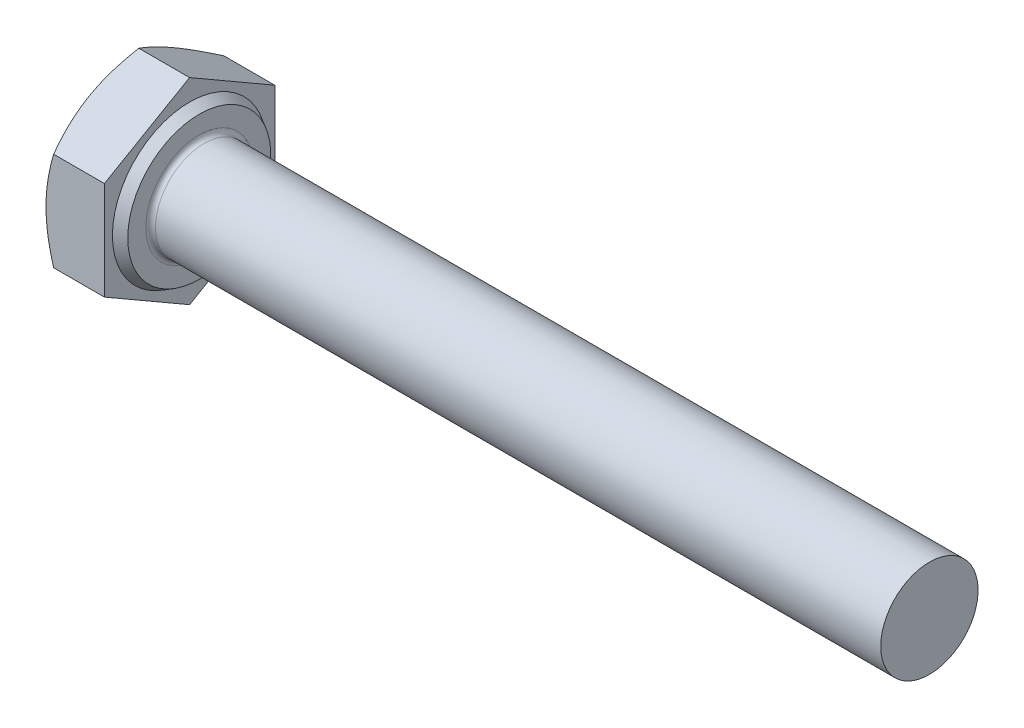
ISO-10303-21;
HEADER;
FILE_DESCRIPTION(('STEP AP214'),'2;1');
FILE_NAME('part.step','',(''),(''),'','','');
FILE_SCHEMA(('AUTOMOTIVE_DESIGN { 1 0 10303 214 1 1 1 1 }'));
ENDSEC;
DATA;
#1=APPLICATION_CONTEXT('core data for automotive mechanical design processes');
#2=APPLICATION_PROTOCOL_DEFINITION('international standard','automotive_design',2000,#1);
#3=PRODUCT_CONTEXT('',#1,'mechanical');
#4=PRODUCT('Part','Part','',(#3));
#5=PRODUCT_RELATED_PRODUCT_CATEGORY('part','',(#4));
#6=PRODUCT_DEFINITION_FORMATION('','',#4);
#7=PRODUCT_DEFINITION_CONTEXT('part definition',#1,'design');
#8=PRODUCT_DEFINITION('design','',#6,#7);
#9=PRODUCT_DEFINITION_SHAPE('','',#8);
#10=(LENGTH_UNIT() NAMED_UNIT(*) SI_UNIT(.MILLI.,.METRE.));
#11=(NAMED_UNIT(*) PLANE_ANGLE_UNIT() SI_UNIT($,.RADIAN.));
#12=(NAMED_UNIT(*) SI_UNIT($,.STERADIAN.) SOLID_ANGLE_UNIT());
#13=UNCERTAINTY_MEASURE_WITH_UNIT(LENGTH_MEASURE(1.E-05),#10,'distance_accuracy_value','');
#14=(GEOMETRIC_REPRESENTATION_CONTEXT(3) GLOBAL_UNCERTAINTY_ASSIGNED_CONTEXT((#13)) GLOBAL_UNIT_ASSIGNED_CONTEXT((#10,
#11,#12)) REPRESENTATION_CONTEXT('',''));
#15=CARTESIAN_POINT('',(0.,0.,0.));
#16=DIRECTION('',(0.,0.,1.));
#17=DIRECTION('',(1.,0.,0.));
#18=AXIS2_PLACEMENT_3D('',#15,#16,#17);
#19=CARTESIAN_POINT('',(2.8,2.02072594216369,-3.5));
#20=DIRECTION('',(0.,-0.866025403784438,0.500000000000001));
#21=DIRECTION('',(0.,-0.500000000000001,-0.866025403784438));
#22=AXIS2_PLACEMENT_3D('',#19,#20,#21);
#23=PLANE('',#22);
#24=DIRECTION('',(0.,0.500000000000001,0.866025403784438));
#25=VECTOR('',#24,1.);
#26=CARTESIAN_POINT('',(2.4,2.02072594216369,-3.5));
#27=LINE('',#26,#25);
#28=CARTESIAN_POINT('',(2.4,2.02072594216369,-3.5));
#29=VERTEX_POINT('',#28);
#30=CARTESIAN_POINT('',(2.4,4.04145188432738,0.));
#31=VERTEX_POINT('',#30);
#32=EDGE_CURVE('E115',#29,#31,#27,.T.);
#33=ORIENTED_EDGE('',*,*,#32,.F.);
#34=DIRECTION('',(-1.,0.,0.));
#35=VECTOR('',#34,1.);
#36=CARTESIAN_POINT('',(2.8,2.02072594216369,-3.5));
#37=LINE('',#36,#35);
#38=CARTESIAN_POINT('',(0.312607391169641,2.02072594216369,-3.5));
#39=VERTEX_POINT('',#38);
#40=EDGE_CURVE('E263',#29,#39,#37,.T.);
#41=ORIENTED_EDGE('',*,*,#40,.T.);
#42=CARTESIAN_POINT('',(0.312674060693371,4.04156735438122,0.0002));
#43=CARTESIAN_POINT('',(0.261385788989984,3.9527667384984,-0.153607178452449));
#44=CARTESIAN_POINT('',(0.214740953816197,3.86319960126198,-0.308742010834424));
#45=CARTESIAN_POINT('',(0.133321875533349,3.68251437287562,-0.621698006576781));
#46=CARTESIAN_POINT('',(0.0985764355845619,3.59139307116725,-0.779524730787495));
#47=CARTESIAN_POINT('',(0.0444900271828364,3.41027974688034,-1.09322221038013));
#48=CARTESIAN_POINT('',(0.0247890862603817,3.32031559103708,-1.24904469916069));
#49=CARTESIAN_POINT('',(0.00127013273725419,3.13996396008052,-1.56142288720537));
#50=CARTESIAN_POINT('',(-0.00256735545443515,3.04957714051106,-1.71797745103423));
#51=CARTESIAN_POINT('',(0.00541530187697707,2.88068384499777,-2.01050921992099));
#52=CARTESIAN_POINT('',(0.0152754340696065,2.80215208834114,-2.14653021245791));
#53=CARTESIAN_POINT('',(0.0465264668994026,2.64560020969753,-2.41768602028899));
#54=CARTESIAN_POINT('',(0.067928043285797,2.56758062920649,-2.55281989768468));
#55=CARTESIAN_POINT('',(0.121430407880576,2.41070596159678,-2.82453479240518));
#56=CARTESIAN_POINT('',(0.153757994445085,2.33187072981463,-2.96108141927834));
#57=CARTESIAN_POINT('',(0.227128933807992,2.17537608630782,-3.2321380929445));
#58=CARTESIAN_POINT('',(0.268155046569865,2.09771466960098,-3.36665161246854));
#59=CARTESIAN_POINT('',(0.312674060693369,2.02061047210985,-3.5002));
#60=B_SPLINE_CURVE_WITH_KNOTS('',3,(#42,#43,#44,#45,#46,#47,#48,#49,#50,#51,#52,#53,#54,#55,#56,
#57,#58,#59),.UNSPECIFIED.,.F.,.F.,(4,2,2,2,2,2,2,2,4),(0.,0.554793832886254,1.11092123814984,
1.65328467083219,2.19498204478403,2.6666513085086,3.13875761298267,3.6213361260051,
4.10296698719188),.UNSPECIFIED.);
#61=CARTESIAN_POINT('',(0.,3.03108891324553,-1.75));
#62=VERTEX_POINT('',#61);
#63=EDGE_CURVE('E171',#62,#39,#60,.T.);
#64=ORIENTED_EDGE('',*,*,#63,.F.);
#65=CARTESIAN_POINT('',(0.312607391169643,4.04145188432738,0.));
#66=VERTEX_POINT('',#65);
#67=EDGE_CURVE('E61',#66,#62,#60,.T.);
#68=ORIENTED_EDGE('',*,*,#67,.F.);
#69=DIRECTION('',(-1.,0.,0.));
#70=VECTOR('',#69,1.);
#71=CARTESIAN_POINT('',(2.8,4.04145188432738,0.));
#72=LINE('',#71,#70);
#73=EDGE_CURVE('E134',#31,#66,#72,.T.);
#74=ORIENTED_EDGE('',*,*,#73,.F.);
#75=EDGE_LOOP('',(#33,#41,#64,#68,#74));
#76=FACE_BOUND('',#75,.T.);
#77=ADVANCED_FACE('F38',(#76),#23,.F.);
#78=CARTESIAN_POINT('',(2.8,4.04145188432738,0.));
#79=DIRECTION('',(0.,-0.866025403784438,-0.500000000000001));
#80=DIRECTION('',(0.,0.500000000000001,-0.866025403784438));
#81=AXIS2_PLACEMENT_3D('',#78,#79,#80);
#82=PLANE('',#81);
#83=DIRECTION('',(0.,-0.500000000000001,0.866025403784438));
#84=VECTOR('',#83,1.);
#85=CARTESIAN_POINT('',(2.4,4.04145188432738,0.));
#86=LINE('',#85,#84);
#87=CARTESIAN_POINT('',(2.4,2.0207259421637,3.5));
#88=VERTEX_POINT('',#87);
#89=EDGE_CURVE('E109',#31,#88,#86,.T.);
#90=ORIENTED_EDGE('',*,*,#89,.F.);
#91=ORIENTED_EDGE('',*,*,#73,.T.);
#92=CARTESIAN_POINT('',(0.312674060693369,2.02061047210985,3.5002));
#93=CARTESIAN_POINT('',(0.261385788989982,2.10941108799267,3.34639282154755));
#94=CARTESIAN_POINT('',(0.214740953816196,2.19897822522909,3.19125798916558));
#95=CARTESIAN_POINT('',(0.133321875533348,2.37966345361545,2.87830199342322));
#96=CARTESIAN_POINT('',(0.0985764355845611,2.47078475532382,2.7204752692125));
#97=CARTESIAN_POINT('',(0.044490027182836,2.65189807961073,2.40677778961987));
#98=CARTESIAN_POINT('',(0.0247890862603815,2.74186223545399,2.25095530083931));
#99=CARTESIAN_POINT('',(0.00127013273725459,2.92221386641056,1.93857711279463));
#100=CARTESIAN_POINT('',(-0.00256735545443442,3.01260068598001,1.78202254896577));
#101=CARTESIAN_POINT('',(0.00541530187697819,3.1814939814933,1.48949078007901));
#102=CARTESIAN_POINT('',(0.0152754340696077,3.26002573814993,1.35346978754209));
#103=CARTESIAN_POINT('',(0.0465264668994042,3.41657761679354,1.08231397971101));
#104=CARTESIAN_POINT('',(0.0679280432857989,3.49459719728458,0.947180102315318));
#105=CARTESIAN_POINT('',(0.121430407880578,3.65147186489429,0.675465207594817));
#106=CARTESIAN_POINT('',(0.153757994445088,3.73030709667644,0.538918580721665));
#107=CARTESIAN_POINT('',(0.227128933807995,3.88680174018324,0.267861907055498));
#108=CARTESIAN_POINT('',(0.268155046569867,3.96446315689009,0.133348387531463));
#109=CARTESIAN_POINT('',(0.312674060693371,4.04156735438122,-0.000200000000000185));
#110=B_SPLINE_CURVE_WITH_KNOTS('',3,(#92,#93,#94,#95,#96,#97,#98,#99,#100,#101,#102,#103,#104,
#105,#106,#107,#108,#109),.UNSPECIFIED.,.F.,.F.,(4,2,2,2,2,2,2,2,4),(0.,0.554793832886253,
1.11092123814984,1.65328467083219,2.19498204478403,2.6666513085086,3.13875761298267,
3.6213361260051,4.10296698719187),.UNSPECIFIED.);
#111=CARTESIAN_POINT('',(0.,3.03108891324553,1.75));
#112=VERTEX_POINT('',#111);
#113=EDGE_CURVE('E219',#112,#66,#110,.T.);
#114=ORIENTED_EDGE('',*,*,#113,.F.);
#115=CARTESIAN_POINT('',(0.312607391169641,2.02072594216369,3.5));
#116=VERTEX_POINT('',#115);
#117=EDGE_CURVE('E133',#116,#112,#110,.T.);
#118=ORIENTED_EDGE('',*,*,#117,.F.);
#119=DIRECTION('',(-1.,0.,0.));
#120=VECTOR('',#119,1.);
#121=CARTESIAN_POINT('',(2.8,2.02072594216369,3.5));
#122=LINE('',#121,#120);
#123=EDGE_CURVE('E124',#88,#116,#122,.T.);
#124=ORIENTED_EDGE('',*,*,#123,.F.);
#125=EDGE_LOOP('',(#90,#91,#114,#118,#124));
#126=FACE_BOUND('',#125,.T.);
#127=ADVANCED_FACE('F131',(#126),#82,.F.);
#128=CARTESIAN_POINT('',(2.8,2.02072594216369,3.5));
#129=DIRECTION('',(0.,0.,-1.));
#130=DIRECTION('',(0.,1.,0.));
#131=AXIS2_PLACEMENT_3D('',#128,#129,#130);
#132=PLANE('',#131);
#133=DIRECTION('',(0.,-1.,0.));
#134=VECTOR('',#133,1.);
#135=CARTESIAN_POINT('',(2.4,2.02072594216369,3.5));
#136=LINE('',#135,#134);
#137=CARTESIAN_POINT('',(2.4,-2.02072594216369,3.50000000000001));
#138=VERTEX_POINT('',#137);
#139=EDGE_CURVE('E112',#88,#138,#136,.T.);
#140=ORIENTED_EDGE('',*,*,#139,.F.);
#141=ORIENTED_EDGE('',*,*,#123,.T.);
#142=CARTESIAN_POINT('',(1.74876972157984,-5.51155991321369,3.5));
#143=CARTESIAN_POINT('',(1.67392335905171,-5.3579514616812,3.5));
#144=CARTESIAN_POINT('',(1.59977092482585,-5.20399921009228,3.5));
#145=CARTESIAN_POINT('',(1.45324265085096,-4.89522454872941,3.5));
#146=CARTESIAN_POINT('',(1.38086707569563,-4.74040201352887,3.5));
#147=CARTESIAN_POINT('',(1.23793493282186,-4.42894615034128,3.5));
#148=CARTESIAN_POINT('',(1.16738971082227,-4.27230759822602,3.5));
#149=CARTESIAN_POINT('',(1.02907715104181,-3.95781335182266,3.5));
#150=CARTESIAN_POINT('',(0.961309687300874,-3.79995771311102,3.5));
#151=CARTESIAN_POINT('',(0.827049257300865,-3.47741113153965,3.5));
#152=CARTESIAN_POINT('',(0.760677039603637,-3.31266966015407,3.5));
#153=CARTESIAN_POINT('',(0.632756390660451,-2.98129055183974,3.5));
#154=CARTESIAN_POINT('',(0.571208488744782,-2.81465270912935,3.5));
#155=CARTESIAN_POINT('',(0.454490935223125,-2.47950135030688,3.5));
#156=CARTESIAN_POINT('',(0.399309072211479,-2.31099212862995,3.5));
#157=CARTESIAN_POINT('',(0.297038623006436,-1.97155788003879,3.5));
#158=CARTESIAN_POINT('',(0.249947575310255,-1.80063360505407,3.5));
#159=CARTESIAN_POINT('',(0.166312731854841,-1.45721769418154,3.5));
#160=CARTESIAN_POINT('',(0.129709932807452,-1.28474069128699,3.5));
#161=CARTESIAN_POINT('',(0.0690664438522148,-0.937557025087311,3.5));
#162=CARTESIAN_POINT('',(0.0450243878605912,-0.762850606367495,3.5));
#163=CARTESIAN_POINT('',(0.0117307991317233,-0.414396256841876,3.5));
#164=CARTESIAN_POINT('',(0.00228260582206833,-0.240667592567808,3.5));
#165=CARTESIAN_POINT('',(-0.00154556659445001,0.106974360360037,3.5));
#166=CARTESIAN_POINT('',(0.00407467645780433,0.280887651698045,3.5));
#167=CARTESIAN_POINT('',(0.0258160054827252,0.57367772999446,3.5));
#168=CARTESIAN_POINT('',(0.0381294862842096,0.692856453275201,3.5));
#169=CARTESIAN_POINT('',(0.0691104272904701,0.930390570440092,3.5));
#170=CARTESIAN_POINT('',(0.0877786801448133,1.04874585973469,3.5));
#171=CARTESIAN_POINT('',(0.152339395306958,1.40238821087657,3.5));
#172=CARTESIAN_POINT('',(0.20677796414363,1.63613518036601,3.5));
#173=CARTESIAN_POINT('',(0.301818253018759,1.98584040729012,3.5));
#174=CARTESIAN_POINT('',(0.336200477312343,2.10359260573207,3.5));
#175=CARTESIAN_POINT('',(0.408694225276309,2.33795452904032,3.5));
#176=CARTESIAN_POINT('',(0.44680577771455,2.45456424508594,3.5));
#177=CARTESIAN_POINT('',(0.526133500138819,2.6866764850323,3.5));
#178=CARTESIAN_POINT('',(0.567348796819712,2.80217931014603,3.5));
#179=CARTESIAN_POINT('',(0.65238331808422,3.03221622177693,3.5));
#180=CARTESIAN_POINT('',(0.696202482848098,3.14675033047981,3.5));
#181=CARTESIAN_POINT('',(0.817586419233473,3.45518824474218,3.5));
#182=CARTESIAN_POINT('',(0.897216282952767,3.64827858337668,3.5));
#183=CARTESIAN_POINT('',(1.061161216531,4.03246733734999,3.5));
#184=CARTESIAN_POINT('',(1.1454768083918,4.22356552793098,3.5));
#185=CARTESIAN_POINT('',(1.31768022375102,4.60422080078618,3.5));
#186=CARTESIAN_POINT('',(1.4055692882719,4.7937773197528,3.5));
#187=CARTESIAN_POINT('',(1.58407294204471,5.17160542987795,3.5));
#188=CARTESIAN_POINT('',(1.67468761529442,5.35987698121653,3.5));
#189=CARTESIAN_POINT('',(1.85818750847656,5.73567568183913,3.5));
#190=CARTESIAN_POINT('',(1.95107608160113,5.92320119040396,3.5));
#191=CARTESIAN_POINT('',(2.13854805032034,6.29740401332884,3.5));
#192=CARTESIAN_POINT('',(2.23313146399147,6.48408131861562,3.5));
#193=CARTESIAN_POINT('',(2.51886264902323,7.04299370579129,3.5));
#194=CARTESIAN_POINT('',(2.71203324129307,7.41419418594085,3.5));
#195=CARTESIAN_POINT('',(3.08131090771228,8.11545297373332,3.5));
#196=CARTESIAN_POINT('',(3.25705679900322,8.44570240603794,3.5));
#197=CARTESIAN_POINT('',(3.61066708019842,9.10509095269336,3.5));
#198=CARTESIAN_POINT('',(3.7885316009934,9.43422999681452,3.5));
#199=CARTESIAN_POINT('',(4.14522643131463,10.0905480448887,3.5));
#200=CARTESIAN_POINT('',(4.32405147197679,10.4177299168719,3.5));
#201=CARTESIAN_POINT('',(4.68290305302711,11.0714005801046,3.5));
#202=CARTESIAN_POINT('',(4.86292949694074,11.397889424295,3.5));
#203=CARTESIAN_POINT('',(5.04339321716841,11.7241348717818,3.5));
#204=B_SPLINE_CURVE_WITH_KNOTS('',3,(#142,#143,#144,#145,#146,#147,#148,#149,#150,#151,#152,
#153,#154,#155,#156,#157,#158,#159,#160,#161,#162,#163,#164,#165,#166,#167,#168,#169,#170,#171,
#172,#173,#174,#175,#176,#177,#178,#179,#180,#181,#182,#183,#184,#185,#186,#187,#188,#189,#190,
#191,#192,#193,#194,#195,#196,#197,#198,#199,#200,#201,#202,#203),.UNSPECIFIED.,.F.,.F.,(4,2,2,
2,2,2,2,2,2,2,2,2,2,2,2,2,2,2,2,2,2,2,2,2,2,2,2,2,2,2,4),(0.,0.512624455055138,1.02532478807013,
1.54067716579031,2.05600614845993,2.58877526662742,3.12160275933496,3.6533905567045,
4.18501627844403,4.71358974605644,5.24210571499795,5.76343550148056,6.28477297414901,
6.64403977227186,7.00335139923843,7.72232402023061,8.0902978978206,8.45827461416728,
8.82614817645966,9.1940132907056,9.82051720102626,10.4470910459092,11.0738843824793,
11.7006970553932,12.3284975462801,12.9563047370264,14.2116350789245,15.333929259245,
16.4562931392235,17.5748776783279,18.6933734490332),.UNSPECIFIED.);
#205=CARTESIAN_POINT('',(0.,0.,3.5));
#206=VERTEX_POINT('',#205);
#207=EDGE_CURVE('E224',#206,#116,#204,.T.);
#208=ORIENTED_EDGE('',*,*,#207,.F.);
#209=CARTESIAN_POINT('',(0.312607391169641,-2.02072594216369,3.5));
#210=VERTEX_POINT('',#209);
#211=EDGE_CURVE('E230',#210,#206,#204,.T.);
#212=ORIENTED_EDGE('',*,*,#211,.F.);
#213=DIRECTION('',(-1.,0.,0.));
#214=VECTOR('',#213,1.);
#215=CARTESIAN_POINT('',(2.8,-2.02072594216369,3.5));
#216=LINE('',#215,#214);
#217=EDGE_CURVE('E127',#138,#210,#216,.T.);
#218=ORIENTED_EDGE('',*,*,#217,.F.);
#219=EDGE_LOOP('',(#140,#141,#208,#212,#218));
#220=FACE_BOUND('',#219,.T.);
#221=ADVANCED_FACE('F122',(#220),#132,.F.);
#222=CARTESIAN_POINT('',(2.8,-4.04145188432739,0.));
#223=DIRECTION('',(0.,0.866025403784438,-0.500000000000001));
#224=DIRECTION('',(0.,0.500000000000001,0.866025403784438));
#225=AXIS2_PLACEMENT_3D('',#222,#223,#224);
#226=PLANE('',#225);
#227=DIRECTION('',(0.,-0.500000000000001,-0.866025403784438));
#228=VECTOR('',#227,1.);
#229=CARTESIAN_POINT('',(2.4,-4.04145188432739,0.));
#230=LINE('',#229,#228);
#231=CARTESIAN_POINT('',(2.4,-4.04145188432738,0.));
#232=VERTEX_POINT('',#231);
#233=EDGE_CURVE('E128',#138,#232,#230,.T.);
#234=ORIENTED_EDGE('',*,*,#233,.F.);
#235=ORIENTED_EDGE('',*,*,#217,.T.);
#236=CARTESIAN_POINT('',(0.312674060693373,-4.04156735438123,-0.000199999999999297));
#237=CARTESIAN_POINT('',(0.261385788989986,-3.95276673849841,0.15360717845245));
#238=CARTESIAN_POINT('',(0.214740953816199,-3.86319960126199,0.308742010834425));
#239=CARTESIAN_POINT('',(0.133321875533351,-3.68251437287563,0.621698006576782));
#240=CARTESIAN_POINT('',(0.0985764355845637,-3.59139307116725,0.779524730787497));
#241=CARTESIAN_POINT('',(0.0444900271828383,-3.41027974688034,1.09322221038013));
#242=CARTESIAN_POINT('',(0.0247890862603835,-3.32031559103708,1.24904469916069));
#243=CARTESIAN_POINT('',(0.00127013273725607,-3.13996396008052,1.56142288720538));
#244=CARTESIAN_POINT('',(-0.00256735545443317,-3.04957714051106,1.71797745103423));
#245=CARTESIAN_POINT('',(0.00541530187697909,-2.88068384499778,2.01050921992099));
#246=CARTESIAN_POINT('',(0.0152754340696084,-2.80215208834115,2.14653021245791));
#247=CARTESIAN_POINT('',(0.0465264668994043,-2.64560020969754,2.417686020289));
#248=CARTESIAN_POINT('',(0.0679280432857985,-2.5675806292065,2.55281989768468));
#249=CARTESIAN_POINT('',(0.121430407880577,-2.41070596159678,2.82453479240518));
#250=CARTESIAN_POINT('',(0.153757994445086,-2.33187072981464,2.96108141927834));
#251=CARTESIAN_POINT('',(0.227128933807993,-2.17537608630783,3.2321380929445));
#252=CARTESIAN_POINT('',(0.268155046569865,-2.09771466960098,3.36665161246854));
#253=CARTESIAN_POINT('',(0.312674060693369,-2.02061047210985,3.5002));
#254=B_SPLINE_CURVE_WITH_KNOTS('',3,(#236,#237,#238,#239,#240,#241,#242,#243,#244,#245,#246,
#247,#248,#249,#250,#251,#252,#253),.UNSPECIFIED.,.F.,.F.,(4,2,2,2,2,2,2,2,4),(0.,
0.554793832886254,1.11092123814984,1.65328467083219,2.19498204478403,2.6666513085086,
3.13875761298267,3.6213361260051,4.10296698719187),.UNSPECIFIED.);
#255=CARTESIAN_POINT('',(0.,-3.03108891324553,1.75));
#256=VERTEX_POINT('',#255);
#257=EDGE_CURVE('E231',#256,#210,#254,.T.);
#258=ORIENTED_EDGE('',*,*,#257,.F.);
#259=CARTESIAN_POINT('',(0.312607391169645,-4.04145188432739,0.));
#260=VERTEX_POINT('',#259);
#261=EDGE_CURVE('E187',#260,#256,#254,.T.);
#262=ORIENTED_EDGE('',*,*,#261,.F.);
#263=DIRECTION('',(-1.,0.,0.));
#264=VECTOR('',#263,1.);
#265=CARTESIAN_POINT('',(2.8,-4.04145188432739,0.));
#266=LINE('',#265,#264);
#267=EDGE_CURVE('E138',#232,#260,#266,.T.);
#268=ORIENTED_EDGE('',*,*,#267,.F.);
#269=EDGE_LOOP('',(#234,#235,#258,#262,#268));
#270=FACE_BOUND('',#269,.T.);
#271=ADVANCED_FACE('F236',(#270),#226,.F.);
#272=CARTESIAN_POINT('',(2.8,-2.0207259421637,-3.5));
#273=DIRECTION('',(0.,0.866025403784439,0.5));
#274=DIRECTION('',(0.,-0.5,0.866025403784439));
#275=AXIS2_PLACEMENT_3D('',#272,#273,#274);
#276=PLANE('',#275);
#277=DIRECTION('',(0.,0.5,-0.866025403784439));
#278=VECTOR('',#277,1.);
#279=CARTESIAN_POINT('',(2.4,-2.0207259421637,-3.5));
#280=LINE('',#279,#278);
#281=CARTESIAN_POINT('',(2.4,-2.0207259421637,-3.5));
#282=VERTEX_POINT('',#281);
#283=EDGE_CURVE('E53',#232,#282,#280,.T.);
#284=ORIENTED_EDGE('',*,*,#283,.F.);
#285=ORIENTED_EDGE('',*,*,#267,.T.);
#286=CARTESIAN_POINT('',(0.312674060693372,-2.02061047210986,-3.5002));
#287=CARTESIAN_POINT('',(0.261385788989984,-2.10941108799268,-3.34639282154755));
#288=CARTESIAN_POINT('',(0.214740953816198,-2.1989782252291,-3.19125798916558));
#289=CARTESIAN_POINT('',(0.133321875533351,-2.37966345361545,-2.87830199342322));
#290=CARTESIAN_POINT('',(0.0985764355845634,-2.47078475532383,-2.72047526921251));
#291=CARTESIAN_POINT('',(0.0444900271828386,-2.65189807961074,-2.40677778961987));
#292=CARTESIAN_POINT('',(0.0247890862603844,-2.741862235454,-2.25095530083931));
#293=CARTESIAN_POINT('',(0.00127013273725749,-2.92221386641056,-1.93857711279463));
#294=CARTESIAN_POINT('',(-0.00256735545443165,-3.01260068598002,-1.78202254896577));
#295=CARTESIAN_POINT('',(0.00541530187698094,-3.1814939814933,-1.48949078007901));
#296=CARTESIAN_POINT('',(0.0152754340696105,-3.26002573814993,-1.35346978754209));
#297=CARTESIAN_POINT('',(0.0465264668994069,-3.41657761679354,-1.08231397971101));
#298=CARTESIAN_POINT('',(0.0679280432858014,-3.49459719728458,-0.947180102315317));
#299=CARTESIAN_POINT('',(0.12143040788058,-3.65147186489429,-0.675465207594816));
#300=CARTESIAN_POINT('',(0.15375799444509,-3.73030709667644,-0.538918580721664));
#301=CARTESIAN_POINT('',(0.227128933807997,-3.88680174018325,-0.267861907055498));
#302=CARTESIAN_POINT('',(0.268155046569869,-3.96446315689009,-0.133348387531463));
#303=CARTESIAN_POINT('',(0.312674060693373,-4.04156735438123,0.00020000000000075));
#304=B_SPLINE_CURVE_WITH_KNOTS('',3,(#286,#287,#288,#289,#290,#291,#292,#293,#294,#295,#296,
#297,#298,#299,#300,#301,#302,#303),.UNSPECIFIED.,.F.,.F.,(4,2,2,2,2,2,2,2,4),(0.,
0.554793832886254,1.11092123814984,1.65328467083219,2.19498204478403,2.6666513085086,
3.13875761298267,3.6213361260051,4.10296698719187),.UNSPECIFIED.);
#305=CARTESIAN_POINT('',(0.,-3.03108891324554,-1.75));
#306=VERTEX_POINT('',#305);
#307=EDGE_CURVE('E282',#306,#260,#304,.T.);
#308=ORIENTED_EDGE('',*,*,#307,.F.);
#309=CARTESIAN_POINT('',(0.312607391169536,-2.02072594216386,-3.5));
#310=VERTEX_POINT('',#309);
#311=EDGE_CURVE('E180',#310,#306,#304,.T.);
#312=ORIENTED_EDGE('',*,*,#311,.F.);
#313=DIRECTION('',(-1.,0.,0.));
#314=VECTOR('',#313,1.);
#315=CARTESIAN_POINT('',(2.8,-2.0207259421637,-3.5));
#316=LINE('',#315,#314);
#317=EDGE_CURVE('E264',#282,#310,#316,.T.);
#318=ORIENTED_EDGE('',*,*,#317,.F.);
#319=EDGE_LOOP('',(#284,#285,#308,#312,#318));
#320=FACE_BOUND('',#319,.T.);
#321=ADVANCED_FACE('F239',(#320),#276,.F.);
#322=CARTESIAN_POINT('',(2.8,2.02072594216369,-3.5));
#323=DIRECTION('',(0.,0.,1.));
#324=DIRECTION('',(1.,0.,0.));
#325=AXIS2_PLACEMENT_3D('',#322,#323,#324);
#326=PLANE('',#325);
#327=DIRECTION('',(0.,1.,0.));
#328=VECTOR('',#327,1.);
#329=CARTESIAN_POINT('',(2.4,2.02072594216369,-3.5));
#330=LINE('',#329,#328);
#331=EDGE_CURVE('E146',#282,#29,#330,.T.);
#332=ORIENTED_EDGE('',*,*,#331,.F.);
#333=ORIENTED_EDGE('',*,*,#317,.T.);
#334=CARTESIAN_POINT('',(1.74876972157984,-5.51155991321369,-3.5));
#335=CARTESIAN_POINT('',(1.67392335905172,-5.35795146168121,-3.5));
#336=CARTESIAN_POINT('',(1.59977092482585,-5.20399921009228,-3.5));
#337=CARTESIAN_POINT('',(1.45324265085097,-4.89522454872941,-3.5));
#338=CARTESIAN_POINT('',(1.38086707569563,-4.74040201352888,-3.5));
#339=CARTESIAN_POINT('',(1.23793493282186,-4.42894615034128,-3.5));
#340=CARTESIAN_POINT('',(1.16738971082228,-4.27230759822602,-3.5));
#341=CARTESIAN_POINT('',(1.02907715104182,-3.95781335182267,-3.5));
#342=CARTESIAN_POINT('',(0.961309687300878,-3.79995771311102,-3.5));
#343=CARTESIAN_POINT('',(0.827049257300869,-3.47741113153965,-3.5));
#344=CARTESIAN_POINT('',(0.760677039603641,-3.31266966015407,-3.5));
#345=CARTESIAN_POINT('',(0.632756390660455,-2.98129055183974,-3.5));
#346=CARTESIAN_POINT('',(0.571208488744786,-2.81465270912935,-3.5));
#347=CARTESIAN_POINT('',(0.454490935223128,-2.47950135030689,-3.5));
#348=CARTESIAN_POINT('',(0.399309072211483,-2.31099212862996,-3.5));
#349=CARTESIAN_POINT('',(0.297038623006439,-1.9715578800388,-3.5));
#350=CARTESIAN_POINT('',(0.249947575310258,-1.80063360505407,-3.5));
#351=CARTESIAN_POINT('',(0.166312731854844,-1.45721769418154,-3.5));
#352=CARTESIAN_POINT('',(0.129709932807455,-1.284740691287,-3.5));
#353=CARTESIAN_POINT('',(0.0690664438522172,-0.937557025087316,-3.5));
#354=CARTESIAN_POINT('',(0.0450243878605935,-0.7628506063675,-3.5));
#355=CARTESIAN_POINT('',(0.0117307991317253,-0.414396256841881,-3.5));
#356=CARTESIAN_POINT('',(0.0022826058220703,-0.240667592567812,-3.5));
#357=CARTESIAN_POINT('',(-0.00154556659444845,0.106974360360033,-3.5));
#358=CARTESIAN_POINT('',(0.00407467645780556,0.280887651698041,-3.5));
#359=CARTESIAN_POINT('',(0.0258160054827262,0.573677729994458,-3.5));
#360=CARTESIAN_POINT('',(0.0381294862842106,0.692856453275198,-3.5));
#361=CARTESIAN_POINT('',(0.0691104272904712,0.930390570440089,-3.5));
#362=CARTESIAN_POINT('',(0.0877786801448144,1.04874585973469,-3.5));
#363=CARTESIAN_POINT('',(0.152339395306959,1.40238821087657,-3.5));
#364=CARTESIAN_POINT('',(0.20677796414363,1.63613518036601,-3.5));
#365=CARTESIAN_POINT('',(0.301818253018759,1.98584040729012,-3.5));
#366=CARTESIAN_POINT('',(0.336200477312343,2.10359260573206,-3.5));
#367=CARTESIAN_POINT('',(0.408694225276309,2.33795452904032,-3.5));
#368=CARTESIAN_POINT('',(0.446805777714549,2.45456424508594,-3.5));
#369=CARTESIAN_POINT('',(0.526133500138819,2.6866764850323,-3.5));
#370=CARTESIAN_POINT('',(0.567348796819712,2.80217931014603,-3.5));
#371=CARTESIAN_POINT('',(0.652383318084219,3.03221622177692,-3.5));
#372=CARTESIAN_POINT('',(0.696202482848097,3.14675033047981,-3.5));
#373=CARTESIAN_POINT('',(0.817586419233472,3.45518824474218,-3.5));
#374=CARTESIAN_POINT('',(0.897216282952766,3.64827858337667,-3.5));
#375=CARTESIAN_POINT('',(1.061161216531,4.03246733734998,-3.5));
#376=CARTESIAN_POINT('',(1.1454768083918,4.22356552793097,-3.5));
#377=CARTESIAN_POINT('',(1.31768022375102,4.60422080078617,-3.5));
#378=CARTESIAN_POINT('',(1.4055692882719,4.7937773197528,-3.5));
#379=CARTESIAN_POINT('',(1.5840729420447,5.17160542987795,-3.5));
#380=CARTESIAN_POINT('',(1.67468761529442,5.35987698121652,-3.5));
#381=CARTESIAN_POINT('',(1.85818750847656,5.73567568183912,-3.5));
#382=CARTESIAN_POINT('',(1.95107608160113,5.92320119040396,-3.5));
#383=CARTESIAN_POINT('',(2.13854805032033,6.29740401332883,-3.5));
#384=CARTESIAN_POINT('',(2.23313146399146,6.48408131861562,-3.5));
#385=CARTESIAN_POINT('',(2.51886264902323,7.04299370579128,-3.5));
#386=CARTESIAN_POINT('',(2.71203324129306,7.41419418594084,-3.5));
#387=CARTESIAN_POINT('',(3.08131090771227,8.11545297373331,-3.5));
#388=CARTESIAN_POINT('',(3.25705679900321,8.44570240603793,-3.5));
#389=CARTESIAN_POINT('',(3.61066708019842,9.10509095269335,-3.5));
#390=CARTESIAN_POINT('',(3.7885316009934,9.43422999681451,-3.5));
#391=CARTESIAN_POINT('',(4.14522643131462,10.0905480448887,-3.5));
#392=CARTESIAN_POINT('',(4.32405147197678,10.4177299168719,-3.5));
#393=CARTESIAN_POINT('',(4.68290305302711,11.0714005801046,-3.5));
#394=CARTESIAN_POINT('',(4.86292949694073,11.397889424295,-3.5));
#395=CARTESIAN_POINT('',(5.04339321716841,11.7241348717818,-3.5));
#396=B_SPLINE_CURVE_WITH_KNOTS('',3,(#334,#335,#336,#337,#338,#339,#340,#341,#342,#343,#344,
#345,#346,#347,#348,#349,#350,#351,#352,#353,#354,#355,#356,#357,#358,#359,#360,#361,#362,#363,
#364,#365,#366,#367,#368,#369,#370,#371,#372,#373,#374,#375,#376,#377,#378,#379,#380,#381,#382,
#383,#384,#385,#386,#387,#388,#389,#390,#391,#392,#393,#394,#395),.UNSPECIFIED.,.F.,.F.,(4,2,2,
2,2,2,2,2,2,2,2,2,2,2,2,2,2,2,2,2,2,2,2,2,2,2,2,2,2,2,4),(0.,0.512624455055139,1.02532478807014,
1.54067716579031,2.05600614845994,2.58877526662743,3.12160275933497,3.6533905567045,
4.18501627844403,4.71358974605644,5.24210571499796,5.76343550148056,6.28477297414902,
6.64403977227186,7.00335139923844,7.72232402023061,8.09029789782061,8.45827461416729,
8.82614817645967,9.19401329070561,9.82051720102627,10.4470910459092,11.0738843824793,
11.7006970553932,12.3284975462801,12.9563047370264,14.2116350789245,15.333929259245,
16.4562931392235,17.5748776783279,18.6933734490332),.UNSPECIFIED.);
#397=CARTESIAN_POINT('',(0.,0.,-3.5));
#398=VERTEX_POINT('',#397);
#399=EDGE_CURVE('E208',#398,#310,#396,.F.);
#400=ORIENTED_EDGE('',*,*,#399,.F.);
#401=EDGE_CURVE('E290',#39,#398,#396,.F.);
#402=ORIENTED_EDGE('',*,*,#401,.F.);
#403=ORIENTED_EDGE('',*,*,#40,.F.);
#404=EDGE_LOOP('',(#332,#333,#400,#402,#403));
#405=FACE_BOUND('',#404,.T.);
#406=ADVANCED_FACE('F243',(#405),#326,.F.);
#407=CARTESIAN_POINT('',(0.,0.,0.));
#408=DIRECTION('',(1.,0.,0.));
#409=DIRECTION('',(0.,0.,-1.));
#410=AXIS2_PLACEMENT_3D('',#407,#408,#409);
#411=CONICAL_SURFACE('',#410,3.5,1.0471975511966);
#412=ORIENTED_EDGE('',*,*,#311,.T.);
#413=CARTESIAN_POINT('',(0.,0.,0.));
#414=DIRECTION('',(1.,0.,0.));
#415=DIRECTION('',(0.,0.,-1.));
#416=AXIS2_PLACEMENT_3D('',#413,#414,#415);
#417=CIRCLE('',#416,3.5);
#418=EDGE_CURVE('E136',#306,#398,#417,.T.);
#419=ORIENTED_EDGE('',*,*,#418,.T.);
#420=ORIENTED_EDGE('',*,*,#399,.T.);
#421=EDGE_LOOP('',(#412,#419,#420));
#422=FACE_BOUND('',#421,.T.);
#423=ADVANCED_FACE('F202',(#422),#411,.T.);
#424=ORIENTED_EDGE('',*,*,#261,.T.);
#425=EDGE_CURVE('E144',#256,#306,#417,.T.);
#426=ORIENTED_EDGE('',*,*,#425,.T.);
#427=ORIENTED_EDGE('',*,*,#307,.T.);
#428=EDGE_LOOP('',(#424,#426,#427));
#429=FACE_BOUND('',#428,.T.);
#430=ADVANCED_FACE('F200',(#429),#411,.T.);
#431=ORIENTED_EDGE('',*,*,#211,.T.);
#432=EDGE_CURVE('E269',#206,#256,#417,.T.);
#433=ORIENTED_EDGE('',*,*,#432,.T.);
#434=ORIENTED_EDGE('',*,*,#257,.T.);
#435=EDGE_LOOP('',(#431,#433,#434));
#436=FACE_BOUND('',#435,.T.);
#437=ADVANCED_FACE('F194',(#436),#411,.T.);
#438=ORIENTED_EDGE('',*,*,#207,.T.);
#439=ORIENTED_EDGE('',*,*,#117,.T.);
#440=CARTESIAN_POINT('',(0.,0.,0.));
#441=DIRECTION('',(-1.,0.,0.));
#442=DIRECTION('',(0.,0.,1.));
#443=AXIS2_PLACEMENT_3D('',#440,#441,#442);
#444=CIRCLE('',#443,3.5);
#445=EDGE_CURVE('E274',#206,#112,#444,.T.);
#446=ORIENTED_EDGE('',*,*,#445,.F.);
#447=EDGE_LOOP('',(#438,#439,#446));
#448=FACE_BOUND('',#447,.T.);
#449=ADVANCED_FACE('F199',(#448),#411,.T.);
#450=ORIENTED_EDGE('',*,*,#113,.T.);
#451=ORIENTED_EDGE('',*,*,#67,.T.);
#452=EDGE_CURVE('E277',#62,#112,#417,.T.);
#453=ORIENTED_EDGE('',*,*,#452,.T.);
#454=EDGE_LOOP('',(#450,#451,#453));
#455=FACE_BOUND('',#454,.T.);
#456=ADVANCED_FACE('F392',(#455),#411,.T.);
#457=ORIENTED_EDGE('',*,*,#63,.T.);
#458=ORIENTED_EDGE('',*,*,#401,.T.);
#459=EDGE_CURVE('E145',#398,#62,#417,.T.);
#460=ORIENTED_EDGE('',*,*,#459,.T.);
#461=EDGE_LOOP('',(#457,#458,#460));
#462=FACE_BOUND('',#461,.T.);
#463=ADVANCED_FACE('F251',(#462),#411,.T.);
#464=CARTESIAN_POINT('',(0.,4.04145188432738,0.));
#465=DIRECTION('',(1.,0.,0.));
#466=DIRECTION('',(0.,0.,-1.));
#467=AXIS2_PLACEMENT_3D('',#464,#465,#466);
#468=PLANE('',#467);
#469=ORIENTED_EDGE('',*,*,#459,.F.);
#470=ORIENTED_EDGE('',*,*,#418,.F.);
#471=ORIENTED_EDGE('',*,*,#425,.F.);
#472=ORIENTED_EDGE('',*,*,#432,.F.);
#473=ORIENTED_EDGE('',*,*,#445,.T.);
#474=ORIENTED_EDGE('',*,*,#452,.F.);
#475=EDGE_LOOP('',(#469,#470,#471,#472,#473,#474));
#476=FACE_BOUND('',#475,.T.);
#477=ADVANCED_FACE('F249',(#476),#468,.F.);
#478=CARTESIAN_POINT('',(2.4,3.17094010767585,0.));
#479=DIRECTION('',(1.,0.,0.));
#480=DIRECTION('',(0.,0.,-1.));
#481=AXIS2_PLACEMENT_3D('',#478,#479,#480);
#482=PLANE('',#481);
#483=CARTESIAN_POINT('',(2.4,0.,0.));
#484=DIRECTION('',(-1.,0.,0.));
#485=DIRECTION('',(0.,0.,1.));
#486=AXIS2_PLACEMENT_3D('',#483,#484,#485);
#487=CIRCLE('',#486,3.17094010767585);
#488=CARTESIAN_POINT('',(2.4,0.,3.17094010767585));
#489=VERTEX_POINT('',#488);
#490=EDGE_CURVE('E300',#489,#489,#487,.T.);
#491=ORIENTED_EDGE('',*,*,#490,.T.);
#492=EDGE_LOOP('',(#491));
#493=FACE_BOUND('',#492,.T.);
#494=ORIENTED_EDGE('',*,*,#32,.T.);
#495=ORIENTED_EDGE('',*,*,#89,.T.);
#496=ORIENTED_EDGE('',*,*,#139,.T.);
#497=ORIENTED_EDGE('',*,*,#233,.T.);
#498=ORIENTED_EDGE('',*,*,#283,.T.);
#499=ORIENTED_EDGE('',*,*,#331,.T.);
#500=EDGE_LOOP('',(#494,#495,#496,#497,#498,#499));
#501=FACE_BOUND('',#500,.T.);
#502=ADVANCED_FACE('F111',(#493,#501),#482,.T.);
#503=CARTESIAN_POINT('',(2.4,0.,0.));
#504=DIRECTION('',(-1.,0.,0.));
#505=DIRECTION('',(0.,0.,1.));
#506=AXIS2_PLACEMENT_3D('',#503,#504,#505);
#507=CONICAL_SURFACE('',#506,3.17094010767585,0.523598775598296);
#508=CARTESIAN_POINT('',(2.8,0.,0.));
#509=DIRECTION('',(-1.,0.,0.));
#510=DIRECTION('',(0.,0.,1.));
#511=AXIS2_PLACEMENT_3D('',#508,#509,#510);
#512=CIRCLE('',#511,2.94);
#513=CARTESIAN_POINT('',(2.8,0.,2.94));
#514=VERTEX_POINT('',#513);
#515=EDGE_CURVE('E303',#514,#514,#512,.T.);
#516=ORIENTED_EDGE('',*,*,#515,.T.);
#517=EDGE_LOOP('',(#516));
#518=FACE_BOUND('',#517,.T.);
#519=ORIENTED_EDGE('',*,*,#490,.F.);
#520=EDGE_LOOP('',(#519));
#521=FACE_BOUND('',#520,.T.);
#522=ADVANCED_FACE('F258',(#518,#521),#507,.T.);
#523=CARTESIAN_POINT('',(32.8,0.,0.));
#524=DIRECTION('',(-1.,0.,0.));
#525=DIRECTION('',(0.,0.,1.));
#526=AXIS2_PLACEMENT_3D('',#523,#524,#525);
#527=PLANE('',#526);
#528=CARTESIAN_POINT('',(32.8,0.,0.));
#529=DIRECTION('',(-1.,0.,0.));
#530=DIRECTION('',(0.,0.,1.));
#531=AXIS2_PLACEMENT_3D('',#528,#529,#530);
#532=CIRCLE('',#531,2.);
#533=CARTESIAN_POINT('',(32.8,0.,2.));
#534=VERTEX_POINT('',#533);
#535=EDGE_CURVE('E232',#534,#534,#532,.T.);
#536=ORIENTED_EDGE('',*,*,#535,.F.);
#537=EDGE_LOOP('',(#536));
#538=FACE_BOUND('',#537,.T.);
#539=ADVANCED_FACE('F204',(#538),#527,.F.);
#540=CARTESIAN_POINT('',(0.,0.,0.));
#541=DIRECTION('',(-1.,0.,0.));
#542=DIRECTION('',(0.,0.,1.));
#543=AXIS2_PLACEMENT_3D('',#540,#541,#542);
#544=CYLINDRICAL_SURFACE('',#543,2.);
#545=CARTESIAN_POINT('',(3.,0.,0.));
#546=DIRECTION('',(1.,0.,0.));
#547=DIRECTION('',(0.,0.,-1.));
#548=AXIS2_PLACEMENT_3D('',#545,#546,#547);
#549=CIRCLE('',#548,2.);
#550=CARTESIAN_POINT('',(3.,0.,-2.));
#551=VERTEX_POINT('',#550);
#552=EDGE_CURVE('E11',#551,#551,#549,.T.);
#553=ORIENTED_EDGE('',*,*,#552,.T.);
#554=EDGE_LOOP('',(#553));
#555=FACE_BOUND('',#554,.T.);
#556=ORIENTED_EDGE('',*,*,#535,.T.);
#557=EDGE_LOOP('',(#556));
#558=FACE_BOUND('',#557,.T.);
#559=ADVANCED_FACE('F158',(#555,#558),#544,.T.);
#560=CARTESIAN_POINT('',(2.8,4.04145188432738,0.));
#561=DIRECTION('',(1.,0.,0.));
#562=DIRECTION('',(0.,0.,-1.));
#563=AXIS2_PLACEMENT_3D('',#560,#561,#562);
#564=PLANE('',#563);
#565=CARTESIAN_POINT('',(2.8,0.,0.));
#566=DIRECTION('',(1.,0.,0.));
#567=DIRECTION('',(0.,0.,-1.));
#568=AXIS2_PLACEMENT_3D('',#565,#566,#567);
#569=CIRCLE('',#568,2.2);
#570=CARTESIAN_POINT('',(2.8,0.,-2.2));
#571=VERTEX_POINT('',#570);
#572=EDGE_CURVE('E46',#571,#571,#569,.F.);
#573=ORIENTED_EDGE('',*,*,#572,.T.);
#574=EDGE_LOOP('',(#573));
#575=FACE_BOUND('',#574,.T.);
#576=ORIENTED_EDGE('',*,*,#515,.F.);
#577=EDGE_LOOP('',(#576));
#578=FACE_BOUND('',#577,.T.);
#579=ADVANCED_FACE('F150',(#575,#578),#564,.T.);
#580=CARTESIAN_POINT('',(3.,0.,0.));
#581=DIRECTION('',(1.,0.,0.));
#582=DIRECTION('',(0.,0.,-1.));
#583=AXIS2_PLACEMENT_3D('',#580,#581,#582);
#584=TOROIDAL_SURFACE('',#583,2.2,0.2);
#585=ORIENTED_EDGE('',*,*,#552,.F.);
#586=EDGE_LOOP('',(#585));
#587=FACE_BOUND('',#586,.T.);
#588=ORIENTED_EDGE('',*,*,#572,.F.);
#589=EDGE_LOOP('',(#588));
#590=FACE_BOUND('',#589,.T.);
#591=ADVANCED_FACE('F40',(#587,#590),#584,.F.);
#592=CLOSED_SHELL('',(#77,#127,#221,#271,#321,#406,#423,#430,#437,#449,#456,#463,#477,#502,#522,
#539,#559,#579,#591));
#593=MANIFOLD_SOLID_BREP('B2',#592);
#594=ADVANCED_BREP_SHAPE_REPRESENTATION('',(#18,#593),#14);
#595=SHAPE_DEFINITION_REPRESENTATION(#9,#594);
ENDSEC;
END-ISO-10303-21;
